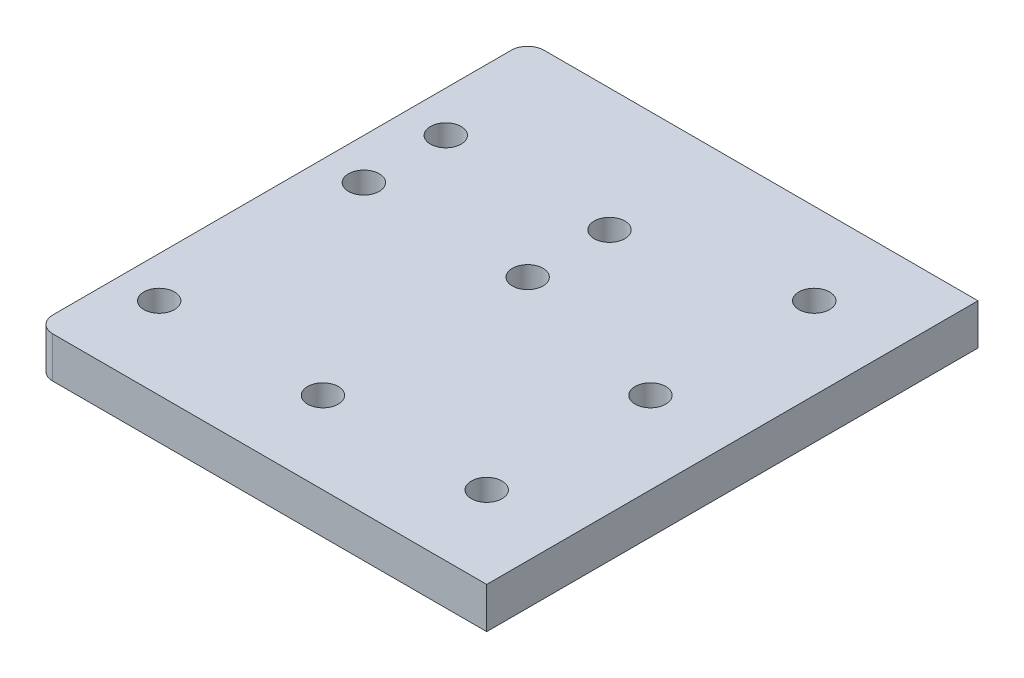
ISO-10303-21;
HEADER;
FILE_DESCRIPTION(('STEP AP214'),'2;1');
FILE_NAME('part.step','',(''),(''),'','','');
FILE_SCHEMA(('AUTOMOTIVE_DESIGN { 1 0 10303 214 1 1 1 1 }'));
ENDSEC;
DATA;
#1=APPLICATION_CONTEXT('core data for automotive mechanical design processes');
#2=APPLICATION_PROTOCOL_DEFINITION('international standard','automotive_design',2000,#1);
#3=PRODUCT_CONTEXT('',#1,'mechanical');
#4=PRODUCT('Part','Part','',(#3));
#5=PRODUCT_RELATED_PRODUCT_CATEGORY('part','',(#4));
#6=PRODUCT_DEFINITION_FORMATION('','',#4);
#7=PRODUCT_DEFINITION_CONTEXT('part definition',#1,'design');
#8=PRODUCT_DEFINITION('design','',#6,#7);
#9=PRODUCT_DEFINITION_SHAPE('','',#8);
#10=(LENGTH_UNIT() NAMED_UNIT(*) SI_UNIT(.MILLI.,.METRE.));
#11=(NAMED_UNIT(*) PLANE_ANGLE_UNIT() SI_UNIT($,.RADIAN.));
#12=(NAMED_UNIT(*) SI_UNIT($,.STERADIAN.) SOLID_ANGLE_UNIT());
#13=UNCERTAINTY_MEASURE_WITH_UNIT(LENGTH_MEASURE(1.E-05),#10,'distance_accuracy_value','');
#14=(GEOMETRIC_REPRESENTATION_CONTEXT(3) GLOBAL_UNCERTAINTY_ASSIGNED_CONTEXT((#13)) GLOBAL_UNIT_ASSIGNED_CONTEXT((#10,
#11,#12)) REPRESENTATION_CONTEXT('',''));
#15=CARTESIAN_POINT('',(0.,0.,0.));
#16=DIRECTION('',(0.,0.,1.));
#17=DIRECTION('',(1.,0.,0.));
#18=AXIS2_PLACEMENT_3D('',#15,#16,#17);
#19=CARTESIAN_POINT('',(0.,6.35,0.));
#20=DIRECTION('',(0.,1.,0.));
#21=DIRECTION('',(0.,0.,1.));
#22=AXIS2_PLACEMENT_3D('',#19,#20,#21);
#23=PLANE('',#22);
#24=CARTESIAN_POINT('',(-3.175,6.35,-19.05));
#25=DIRECTION('',(0.,1.,0.));
#26=DIRECTION('',(0.,0.,1.));
#27=AXIS2_PLACEMENT_3D('',#24,#25,#26);
#28=CIRCLE('',#27,2.38125);
#29=CARTESIAN_POINT('',(-3.175,6.35,-16.66875));
#30=VERTEX_POINT('',#29);
#31=EDGE_CURVE('E351',#30,#30,#28,.T.);
#32=ORIENTED_EDGE('',*,*,#31,.F.);
#33=EDGE_LOOP('',(#32));
#34=FACE_BOUND('',#33,.T.);
#35=CARTESIAN_POINT('',(-28.575,6.35,-6.34999999999997));
#36=DIRECTION('',(0.,1.,0.));
#37=DIRECTION('',(0.,0.,1.));
#38=AXIS2_PLACEMENT_3D('',#35,#36,#37);
#39=CIRCLE('',#38,2.38125);
#40=CARTESIAN_POINT('',(-28.575,6.35,-3.96874999999997));
#41=VERTEX_POINT('',#40);
#42=EDGE_CURVE('E363',#41,#41,#39,.T.);
#43=ORIENTED_EDGE('',*,*,#42,.F.);
#44=EDGE_LOOP('',(#43));
#45=FACE_BOUND('',#44,.T.);
#46=CARTESIAN_POINT('',(-28.575,6.35,25.4));
#47=DIRECTION('',(0.,1.,0.));
#48=DIRECTION('',(0.,0.,1.));
#49=AXIS2_PLACEMENT_3D('',#46,#47,#48);
#50=CIRCLE('',#49,2.38125);
#51=CARTESIAN_POINT('',(-28.575,6.35,27.78125));
#52=VERTEX_POINT('',#51);
#53=EDGE_CURVE('E375',#52,#52,#50,.T.);
#54=ORIENTED_EDGE('',*,*,#53,.F.);
#55=EDGE_LOOP('',(#54));
#56=FACE_BOUND('',#55,.T.);
#57=CARTESIAN_POINT('',(22.225,6.35,25.4));
#58=DIRECTION('',(0.,1.,0.));
#59=DIRECTION('',(0.,0.,1.));
#60=AXIS2_PLACEMENT_3D('',#57,#58,#59);
#61=CIRCLE('',#60,2.38125);
#62=CARTESIAN_POINT('',(22.225,6.35,27.78125));
#63=VERTEX_POINT('',#62);
#64=EDGE_CURVE('E387',#63,#63,#61,.T.);
#65=ORIENTED_EDGE('',*,*,#64,.F.);
#66=EDGE_LOOP('',(#65));
#67=FACE_BOUND('',#66,.T.);
#68=DIRECTION('',(-1.,0.,0.));
#69=VECTOR('',#68,1.);
#70=CARTESIAN_POINT('',(-34.925,6.35,-38.1));
#71=LINE('',#70,#69);
#72=CARTESIAN_POINT('',(34.925,6.35,-38.1));
#73=VERTEX_POINT('',#72);
#74=CARTESIAN_POINT('',(-32.385,6.35,-38.1));
#75=VERTEX_POINT('',#74);
#76=EDGE_CURVE('E89',#73,#75,#71,.T.);
#77=ORIENTED_EDGE('',*,*,#76,.T.);
#78=CARTESIAN_POINT('',(-32.385,6.35,-35.56));
#79=DIRECTION('',(0.,1.,0.));
#80=DIRECTION('',(0.,0.,1.));
#81=AXIS2_PLACEMENT_3D('',#78,#79,#80);
#82=CIRCLE('',#81,2.54);
#83=CARTESIAN_POINT('',(-34.925,6.35,-35.56));
#84=VERTEX_POINT('',#83);
#85=EDGE_CURVE('E44',#75,#84,#82,.T.);
#86=ORIENTED_EDGE('',*,*,#85,.T.);
#87=DIRECTION('',(0.,0.,1.));
#88=VECTOR('',#87,1.);
#89=CARTESIAN_POINT('',(-34.925,6.35,-38.1));
#90=LINE('',#89,#88);
#91=CARTESIAN_POINT('',(-34.925,6.35,35.56));
#92=VERTEX_POINT('',#91);
#93=EDGE_CURVE('E96',#84,#92,#90,.T.);
#94=ORIENTED_EDGE('',*,*,#93,.T.);
#95=CARTESIAN_POINT('',(-32.385,6.35,35.56));
#96=DIRECTION('',(0.,1.,0.));
#97=DIRECTION('',(0.,0.,1.));
#98=AXIS2_PLACEMENT_3D('',#95,#96,#97);
#99=CIRCLE('',#98,2.54);
#100=CARTESIAN_POINT('',(-32.385,6.35,38.1));
#101=VERTEX_POINT('',#100);
#102=EDGE_CURVE('E51',#92,#101,#99,.T.);
#103=ORIENTED_EDGE('',*,*,#102,.T.);
#104=DIRECTION('',(1.,0.,0.));
#105=VECTOR('',#104,1.);
#106=CARTESIAN_POINT('',(-34.925,6.35,38.1));
#107=LINE('',#106,#105);
#108=CARTESIAN_POINT('',(34.925,6.35,38.1));
#109=VERTEX_POINT('',#108);
#110=EDGE_CURVE('E101',#101,#109,#107,.T.);
#111=ORIENTED_EDGE('',*,*,#110,.T.);
#112=DIRECTION('',(0.,0.,-1.));
#113=VECTOR('',#112,1.);
#114=CARTESIAN_POINT('',(34.925,6.35,-38.1));
#115=LINE('',#114,#113);
#116=EDGE_CURVE('E97',#109,#73,#115,.T.);
#117=ORIENTED_EDGE('',*,*,#116,.T.);
#118=EDGE_LOOP('',(#77,#86,#94,#103,#111,#117));
#119=FACE_BOUND('',#118,.T.);
#120=CARTESIAN_POINT('',(22.225,6.35,0.));
#121=DIRECTION('',(0.,1.,0.));
#122=DIRECTION('',(0.,0.,1.));
#123=AXIS2_PLACEMENT_3D('',#120,#121,#122);
#124=CIRCLE('',#123,2.38125);
#125=CARTESIAN_POINT('',(22.225,6.35,2.38125000000002));
#126=VERTEX_POINT('',#125);
#127=EDGE_CURVE('E142',#126,#126,#124,.T.);
#128=ORIENTED_EDGE('',*,*,#127,.F.);
#129=EDGE_LOOP('',(#128));
#130=FACE_BOUND('',#129,.T.);
#131=CARTESIAN_POINT('',(22.225,6.35,-25.4));
#132=DIRECTION('',(0.,1.,0.));
#133=DIRECTION('',(0.,0.,1.));
#134=AXIS2_PLACEMENT_3D('',#131,#132,#133);
#135=CIRCLE('',#134,2.38125);
#136=CARTESIAN_POINT('',(22.225,6.35,-23.01875));
#137=VERTEX_POINT('',#136);
#138=EDGE_CURVE('E381',#137,#137,#135,.T.);
#139=ORIENTED_EDGE('',*,*,#138,.F.);
#140=EDGE_LOOP('',(#139));
#141=FACE_BOUND('',#140,.T.);
#142=CARTESIAN_POINT('',(-28.575,6.35,-19.05));
#143=DIRECTION('',(0.,1.,0.));
#144=DIRECTION('',(0.,0.,1.));
#145=AXIS2_PLACEMENT_3D('',#142,#143,#144);
#146=CIRCLE('',#145,2.38125);
#147=CARTESIAN_POINT('',(-28.575,6.35,-16.66875));
#148=VERTEX_POINT('',#147);
#149=EDGE_CURVE('E369',#148,#148,#146,.T.);
#150=ORIENTED_EDGE('',*,*,#149,.F.);
#151=EDGE_LOOP('',(#150));
#152=FACE_BOUND('',#151,.T.);
#153=CARTESIAN_POINT('',(-3.175,6.35,25.4));
#154=DIRECTION('',(0.,1.,0.));
#155=DIRECTION('',(0.,0.,1.));
#156=AXIS2_PLACEMENT_3D('',#153,#154,#155);
#157=CIRCLE('',#156,2.38125);
#158=CARTESIAN_POINT('',(-3.175,6.35,27.78125));
#159=VERTEX_POINT('',#158);
#160=EDGE_CURVE('E357',#159,#159,#157,.T.);
#161=ORIENTED_EDGE('',*,*,#160,.F.);
#162=EDGE_LOOP('',(#161));
#163=FACE_BOUND('',#162,.T.);
#164=CARTESIAN_POINT('',(-3.175,6.35,-6.34999999999997));
#165=DIRECTION('',(0.,1.,0.));
#166=DIRECTION('',(0.,0.,1.));
#167=AXIS2_PLACEMENT_3D('',#164,#165,#166);
#168=CIRCLE('',#167,2.38125);
#169=CARTESIAN_POINT('',(-3.175,6.35,-3.96874999999997));
#170=VERTEX_POINT('',#169);
#171=EDGE_CURVE('E342',#170,#170,#168,.T.);
#172=ORIENTED_EDGE('',*,*,#171,.F.);
#173=EDGE_LOOP('',(#172));
#174=FACE_BOUND('',#173,.T.);
#175=ADVANCED_FACE('F36',(#34,#45,#56,#67,#119,#130,#141,#152,#163,#174),#23,.T.);
#176=CARTESIAN_POINT('',(0.,0.,0.));
#177=DIRECTION('',(0.,1.,0.));
#178=DIRECTION('',(0.,0.,1.));
#179=AXIS2_PLACEMENT_3D('',#176,#177,#178);
#180=PLANE('',#179);
#181=DIRECTION('',(0.,0.,1.));
#182=VECTOR('',#181,1.);
#183=CARTESIAN_POINT('',(-34.925,0.,-38.1));
#184=LINE('',#183,#182);
#185=CARTESIAN_POINT('',(-34.925,0.,-35.56));
#186=VERTEX_POINT('',#185);
#187=CARTESIAN_POINT('',(-34.925,0.,35.56));
#188=VERTEX_POINT('',#187);
#189=EDGE_CURVE('E139',#186,#188,#184,.T.);
#190=ORIENTED_EDGE('',*,*,#189,.F.);
#191=CARTESIAN_POINT('',(-32.385,0.,-35.56));
#192=DIRECTION('',(0.,1.,0.));
#193=DIRECTION('',(0.,0.,1.));
#194=AXIS2_PLACEMENT_3D('',#191,#192,#193);
#195=CIRCLE('',#194,2.54);
#196=CARTESIAN_POINT('',(-32.385,0.,-38.1));
#197=VERTEX_POINT('',#196);
#198=EDGE_CURVE('E122',#186,#197,#195,.F.);
#199=ORIENTED_EDGE('',*,*,#198,.T.);
#200=DIRECTION('',(-1.,0.,0.));
#201=VECTOR('',#200,1.);
#202=CARTESIAN_POINT('',(-34.925,0.,-38.1));
#203=LINE('',#202,#201);
#204=CARTESIAN_POINT('',(34.925,0.,-38.1));
#205=VERTEX_POINT('',#204);
#206=EDGE_CURVE('E138',#205,#197,#203,.T.);
#207=ORIENTED_EDGE('',*,*,#206,.F.);
#208=DIRECTION('',(0.,0.,-1.));
#209=VECTOR('',#208,1.);
#210=CARTESIAN_POINT('',(34.925,0.,-38.1));
#211=LINE('',#210,#209);
#212=CARTESIAN_POINT('',(34.925,0.,38.1));
#213=VERTEX_POINT('',#212);
#214=EDGE_CURVE('E109',#213,#205,#211,.T.);
#215=ORIENTED_EDGE('',*,*,#214,.F.);
#216=DIRECTION('',(1.,0.,0.));
#217=VECTOR('',#216,1.);
#218=CARTESIAN_POINT('',(-34.925,0.,38.1));
#219=LINE('',#218,#217);
#220=CARTESIAN_POINT('',(-32.385,0.,38.1));
#221=VERTEX_POINT('',#220);
#222=EDGE_CURVE('E105',#221,#213,#219,.T.);
#223=ORIENTED_EDGE('',*,*,#222,.F.);
#224=CARTESIAN_POINT('',(-32.385,0.,35.56));
#225=DIRECTION('',(0.,1.,0.));
#226=DIRECTION('',(0.,0.,1.));
#227=AXIS2_PLACEMENT_3D('',#224,#225,#226);
#228=CIRCLE('',#227,2.54);
#229=EDGE_CURVE('E120',#221,#188,#228,.F.);
#230=ORIENTED_EDGE('',*,*,#229,.T.);
#231=EDGE_LOOP('',(#190,#199,#207,#215,#223,#230));
#232=FACE_BOUND('',#231,.T.);
#233=CARTESIAN_POINT('',(22.225,0.,0.));
#234=DIRECTION('',(0.,1.,0.));
#235=DIRECTION('',(0.,0.,1.));
#236=AXIS2_PLACEMENT_3D('',#233,#234,#235);
#237=CIRCLE('',#236,2.38125);
#238=CARTESIAN_POINT('',(22.225,0.,2.38125000000002));
#239=VERTEX_POINT('',#238);
#240=EDGE_CURVE('E390',#239,#239,#237,.T.);
#241=ORIENTED_EDGE('',*,*,#240,.T.);
#242=EDGE_LOOP('',(#241));
#243=FACE_BOUND('',#242,.T.);
#244=CARTESIAN_POINT('',(22.225,0.,25.4));
#245=DIRECTION('',(0.,1.,0.));
#246=DIRECTION('',(0.,0.,1.));
#247=AXIS2_PLACEMENT_3D('',#244,#245,#246);
#248=CIRCLE('',#247,2.38125);
#249=CARTESIAN_POINT('',(22.225,0.,27.78125));
#250=VERTEX_POINT('',#249);
#251=EDGE_CURVE('E384',#250,#250,#248,.T.);
#252=ORIENTED_EDGE('',*,*,#251,.T.);
#253=EDGE_LOOP('',(#252));
#254=FACE_BOUND('',#253,.T.);
#255=CARTESIAN_POINT('',(22.225,0.,-25.4));
#256=DIRECTION('',(0.,1.,0.));
#257=DIRECTION('',(0.,0.,1.));
#258=AXIS2_PLACEMENT_3D('',#255,#256,#257);
#259=CIRCLE('',#258,2.38125);
#260=CARTESIAN_POINT('',(22.225,0.,-23.01875));
#261=VERTEX_POINT('',#260);
#262=EDGE_CURVE('E378',#261,#261,#259,.T.);
#263=ORIENTED_EDGE('',*,*,#262,.T.);
#264=EDGE_LOOP('',(#263));
#265=FACE_BOUND('',#264,.T.);
#266=CARTESIAN_POINT('',(-28.575,0.,25.4));
#267=DIRECTION('',(0.,1.,0.));
#268=DIRECTION('',(0.,0.,1.));
#269=AXIS2_PLACEMENT_3D('',#266,#267,#268);
#270=CIRCLE('',#269,2.38125);
#271=CARTESIAN_POINT('',(-28.575,0.,27.78125));
#272=VERTEX_POINT('',#271);
#273=EDGE_CURVE('E372',#272,#272,#270,.T.);
#274=ORIENTED_EDGE('',*,*,#273,.T.);
#275=EDGE_LOOP('',(#274));
#276=FACE_BOUND('',#275,.T.);
#277=CARTESIAN_POINT('',(-28.575,0.,-19.05));
#278=DIRECTION('',(0.,1.,0.));
#279=DIRECTION('',(0.,0.,1.));
#280=AXIS2_PLACEMENT_3D('',#277,#278,#279);
#281=CIRCLE('',#280,2.38125);
#282=CARTESIAN_POINT('',(-28.575,0.,-16.66875));
#283=VERTEX_POINT('',#282);
#284=EDGE_CURVE('E366',#283,#283,#281,.T.);
#285=ORIENTED_EDGE('',*,*,#284,.T.);
#286=EDGE_LOOP('',(#285));
#287=FACE_BOUND('',#286,.T.);
#288=CARTESIAN_POINT('',(-28.575,0.,-6.34999999999997));
#289=DIRECTION('',(0.,1.,0.));
#290=DIRECTION('',(0.,0.,1.));
#291=AXIS2_PLACEMENT_3D('',#288,#289,#290);
#292=CIRCLE('',#291,2.38125);
#293=CARTESIAN_POINT('',(-28.575,0.,-3.96874999999997));
#294=VERTEX_POINT('',#293);
#295=EDGE_CURVE('E360',#294,#294,#292,.T.);
#296=ORIENTED_EDGE('',*,*,#295,.T.);
#297=EDGE_LOOP('',(#296));
#298=FACE_BOUND('',#297,.T.);
#299=CARTESIAN_POINT('',(-3.175,0.,25.4));
#300=DIRECTION('',(0.,1.,0.));
#301=DIRECTION('',(0.,0.,1.));
#302=AXIS2_PLACEMENT_3D('',#299,#300,#301);
#303=CIRCLE('',#302,2.38125);
#304=CARTESIAN_POINT('',(-3.175,0.,27.78125));
#305=VERTEX_POINT('',#304);
#306=EDGE_CURVE('E354',#305,#305,#303,.T.);
#307=ORIENTED_EDGE('',*,*,#306,.T.);
#308=EDGE_LOOP('',(#307));
#309=FACE_BOUND('',#308,.T.);
#310=CARTESIAN_POINT('',(-3.175,0.,-19.05));
#311=DIRECTION('',(0.,1.,0.));
#312=DIRECTION('',(0.,0.,1.));
#313=AXIS2_PLACEMENT_3D('',#310,#311,#312);
#314=CIRCLE('',#313,2.38125);
#315=CARTESIAN_POINT('',(-3.175,0.,-16.66875));
#316=VERTEX_POINT('',#315);
#317=EDGE_CURVE('E348',#316,#316,#314,.T.);
#318=ORIENTED_EDGE('',*,*,#317,.T.);
#319=EDGE_LOOP('',(#318));
#320=FACE_BOUND('',#319,.T.);
#321=CARTESIAN_POINT('',(-3.175,0.,-6.34999999999997));
#322=DIRECTION('',(0.,1.,0.));
#323=DIRECTION('',(0.,0.,1.));
#324=AXIS2_PLACEMENT_3D('',#321,#322,#323);
#325=CIRCLE('',#324,2.38125);
#326=CARTESIAN_POINT('',(-3.175,0.,-3.96874999999997));
#327=VERTEX_POINT('',#326);
#328=EDGE_CURVE('E345',#327,#327,#325,.T.);
#329=ORIENTED_EDGE('',*,*,#328,.T.);
#330=EDGE_LOOP('',(#329));
#331=FACE_BOUND('',#330,.T.);
#332=ADVANCED_FACE('F136',(#232,#243,#254,#265,#276,#287,#298,#309,#320,#331),#180,.F.);
#333=CARTESIAN_POINT('',(34.925,6.35,-38.1));
#334=DIRECTION('',(-1.,0.,0.));
#335=DIRECTION('',(0.,0.,1.));
#336=AXIS2_PLACEMENT_3D('',#333,#334,#335);
#337=PLANE('',#336);
#338=ORIENTED_EDGE('',*,*,#214,.T.);
#339=DIRECTION('',(0.,-1.,0.));
#340=VECTOR('',#339,1.);
#341=CARTESIAN_POINT('',(34.925,6.35,-38.1));
#342=LINE('',#341,#340);
#343=EDGE_CURVE('E93',#73,#205,#342,.T.);
#344=ORIENTED_EDGE('',*,*,#343,.F.);
#345=ORIENTED_EDGE('',*,*,#116,.F.);
#346=DIRECTION('',(0.,-1.,0.));
#347=VECTOR('',#346,1.);
#348=CARTESIAN_POINT('',(34.925,6.35,38.1));
#349=LINE('',#348,#347);
#350=EDGE_CURVE('E111',#109,#213,#349,.T.);
#351=ORIENTED_EDGE('',*,*,#350,.T.);
#352=EDGE_LOOP('',(#338,#344,#345,#351));
#353=FACE_BOUND('',#352,.T.);
#354=ADVANCED_FACE('F107',(#353),#337,.F.);
#355=CARTESIAN_POINT('',(-34.925,6.35,-38.1));
#356=DIRECTION('',(0.,0.,1.));
#357=DIRECTION('',(1.,0.,0.));
#358=AXIS2_PLACEMENT_3D('',#355,#356,#357);
#359=PLANE('',#358);
#360=ORIENTED_EDGE('',*,*,#206,.T.);
#361=DIRECTION('',(0.,-1.,0.));
#362=VECTOR('',#361,1.);
#363=CARTESIAN_POINT('',(-32.385,6.35,-38.1));
#364=LINE('',#363,#362);
#365=EDGE_CURVE('E59',#197,#75,#364,.F.);
#366=ORIENTED_EDGE('',*,*,#365,.T.);
#367=ORIENTED_EDGE('',*,*,#76,.F.);
#368=ORIENTED_EDGE('',*,*,#343,.T.);
#369=EDGE_LOOP('',(#360,#366,#367,#368));
#370=FACE_BOUND('',#369,.T.);
#371=ADVANCED_FACE('F91',(#370),#359,.F.);
#372=CARTESIAN_POINT('',(-34.925,6.35,-38.1));
#373=DIRECTION('',(1.,0.,0.));
#374=DIRECTION('',(0.,0.,-1.));
#375=AXIS2_PLACEMENT_3D('',#372,#373,#374);
#376=PLANE('',#375);
#377=ORIENTED_EDGE('',*,*,#93,.F.);
#378=DIRECTION('',(0.,-1.,0.));
#379=VECTOR('',#378,1.);
#380=CARTESIAN_POINT('',(-34.925,6.35,-35.56));
#381=LINE('',#380,#379);
#382=EDGE_CURVE('E113',#84,#186,#381,.T.);
#383=ORIENTED_EDGE('',*,*,#382,.T.);
#384=ORIENTED_EDGE('',*,*,#189,.T.);
#385=DIRECTION('',(0.,-1.,0.));
#386=VECTOR('',#385,1.);
#387=CARTESIAN_POINT('',(-34.925,6.35,35.56));
#388=LINE('',#387,#386);
#389=EDGE_CURVE('E110',#188,#92,#388,.F.);
#390=ORIENTED_EDGE('',*,*,#389,.T.);
#391=EDGE_LOOP('',(#377,#383,#384,#390));
#392=FACE_BOUND('',#391,.T.);
#393=ADVANCED_FACE('F129',(#392),#376,.F.);
#394=CARTESIAN_POINT('',(-34.925,6.35,38.1));
#395=DIRECTION('',(0.,0.,-1.));
#396=DIRECTION('',(-1.,0.,0.));
#397=AXIS2_PLACEMENT_3D('',#394,#395,#396);
#398=PLANE('',#397);
#399=ORIENTED_EDGE('',*,*,#110,.F.);
#400=DIRECTION('',(0.,-1.,0.));
#401=VECTOR('',#400,1.);
#402=CARTESIAN_POINT('',(-32.385,6.35,38.1));
#403=LINE('',#402,#401);
#404=EDGE_CURVE('E11',#101,#221,#403,.T.);
#405=ORIENTED_EDGE('',*,*,#404,.T.);
#406=ORIENTED_EDGE('',*,*,#222,.T.);
#407=ORIENTED_EDGE('',*,*,#350,.F.);
#408=EDGE_LOOP('',(#399,#405,#406,#407));
#409=FACE_BOUND('',#408,.T.);
#410=ADVANCED_FACE('F147',(#409),#398,.F.);
#411=CARTESIAN_POINT('',(22.225,6.35,0.));
#412=DIRECTION('',(0.,-1.,0.));
#413=DIRECTION('',(0.,0.,-1.));
#414=AXIS2_PLACEMENT_3D('',#411,#412,#413);
#415=CYLINDRICAL_SURFACE('',#414,2.38125);
#416=ORIENTED_EDGE('',*,*,#127,.T.);
#417=EDGE_LOOP('',(#416));
#418=FACE_BOUND('',#417,.T.);
#419=ORIENTED_EDGE('',*,*,#240,.F.);
#420=EDGE_LOOP('',(#419));
#421=FACE_BOUND('',#420,.T.);
#422=ADVANCED_FACE('F165',(#418,#421),#415,.F.);
#423=CARTESIAN_POINT('',(22.225,6.35,25.4));
#424=DIRECTION('',(0.,-1.,0.));
#425=DIRECTION('',(0.,0.,-1.));
#426=AXIS2_PLACEMENT_3D('',#423,#424,#425);
#427=CYLINDRICAL_SURFACE('',#426,2.38125);
#428=ORIENTED_EDGE('',*,*,#64,.T.);
#429=EDGE_LOOP('',(#428));
#430=FACE_BOUND('',#429,.T.);
#431=ORIENTED_EDGE('',*,*,#251,.F.);
#432=EDGE_LOOP('',(#431));
#433=FACE_BOUND('',#432,.T.);
#434=ADVANCED_FACE('F198',(#430,#433),#427,.F.);
#435=CARTESIAN_POINT('',(22.225,6.35,-25.4));
#436=DIRECTION('',(0.,-1.,0.));
#437=DIRECTION('',(0.,0.,-1.));
#438=AXIS2_PLACEMENT_3D('',#435,#436,#437);
#439=CYLINDRICAL_SURFACE('',#438,2.38125);
#440=ORIENTED_EDGE('',*,*,#138,.T.);
#441=EDGE_LOOP('',(#440));
#442=FACE_BOUND('',#441,.T.);
#443=ORIENTED_EDGE('',*,*,#262,.F.);
#444=EDGE_LOOP('',(#443));
#445=FACE_BOUND('',#444,.T.);
#446=ADVANCED_FACE('F205',(#442,#445),#439,.F.);
#447=CARTESIAN_POINT('',(-28.575,6.35,25.4));
#448=DIRECTION('',(0.,-1.,0.));
#449=DIRECTION('',(0.,0.,-1.));
#450=AXIS2_PLACEMENT_3D('',#447,#448,#449);
#451=CYLINDRICAL_SURFACE('',#450,2.38125);
#452=ORIENTED_EDGE('',*,*,#53,.T.);
#453=EDGE_LOOP('',(#452));
#454=FACE_BOUND('',#453,.T.);
#455=ORIENTED_EDGE('',*,*,#273,.F.);
#456=EDGE_LOOP('',(#455));
#457=FACE_BOUND('',#456,.T.);
#458=ADVANCED_FACE('F212',(#454,#457),#451,.F.);
#459=CARTESIAN_POINT('',(-28.575,6.35,-19.05));
#460=DIRECTION('',(0.,-1.,0.));
#461=DIRECTION('',(0.,0.,-1.));
#462=AXIS2_PLACEMENT_3D('',#459,#460,#461);
#463=CYLINDRICAL_SURFACE('',#462,2.38125);
#464=ORIENTED_EDGE('',*,*,#149,.T.);
#465=EDGE_LOOP('',(#464));
#466=FACE_BOUND('',#465,.T.);
#467=ORIENTED_EDGE('',*,*,#284,.F.);
#468=EDGE_LOOP('',(#467));
#469=FACE_BOUND('',#468,.T.);
#470=ADVANCED_FACE('F220',(#466,#469),#463,.F.);
#471=CARTESIAN_POINT('',(-28.575,6.35,-6.34999999999997));
#472=DIRECTION('',(0.,-1.,0.));
#473=DIRECTION('',(0.,0.,-1.));
#474=AXIS2_PLACEMENT_3D('',#471,#472,#473);
#475=CYLINDRICAL_SURFACE('',#474,2.38125);
#476=ORIENTED_EDGE('',*,*,#42,.T.);
#477=EDGE_LOOP('',(#476));
#478=FACE_BOUND('',#477,.T.);
#479=ORIENTED_EDGE('',*,*,#295,.F.);
#480=EDGE_LOOP('',(#479));
#481=FACE_BOUND('',#480,.T.);
#482=ADVANCED_FACE('F228',(#478,#481),#475,.F.);
#483=CARTESIAN_POINT('',(-3.175,6.35,25.4));
#484=DIRECTION('',(0.,-1.,0.));
#485=DIRECTION('',(0.,0.,-1.));
#486=AXIS2_PLACEMENT_3D('',#483,#484,#485);
#487=CYLINDRICAL_SURFACE('',#486,2.38125);
#488=ORIENTED_EDGE('',*,*,#160,.T.);
#489=EDGE_LOOP('',(#488));
#490=FACE_BOUND('',#489,.T.);
#491=ORIENTED_EDGE('',*,*,#306,.F.);
#492=EDGE_LOOP('',(#491));
#493=FACE_BOUND('',#492,.T.);
#494=ADVANCED_FACE('F236',(#490,#493),#487,.F.);
#495=CARTESIAN_POINT('',(-3.175,6.35,-19.05));
#496=DIRECTION('',(0.,-1.,0.));
#497=DIRECTION('',(0.,0.,-1.));
#498=AXIS2_PLACEMENT_3D('',#495,#496,#497);
#499=CYLINDRICAL_SURFACE('',#498,2.38125);
#500=ORIENTED_EDGE('',*,*,#31,.T.);
#501=EDGE_LOOP('',(#500));
#502=FACE_BOUND('',#501,.T.);
#503=ORIENTED_EDGE('',*,*,#317,.F.);
#504=EDGE_LOOP('',(#503));
#505=FACE_BOUND('',#504,.T.);
#506=ADVANCED_FACE('F244',(#502,#505),#499,.F.);
#507=CARTESIAN_POINT('',(-3.175,6.35,-6.34999999999997));
#508=DIRECTION('',(0.,-1.,0.));
#509=DIRECTION('',(0.,0.,-1.));
#510=AXIS2_PLACEMENT_3D('',#507,#508,#509);
#511=CYLINDRICAL_SURFACE('',#510,2.38125);
#512=ORIENTED_EDGE('',*,*,#171,.T.);
#513=EDGE_LOOP('',(#512));
#514=FACE_BOUND('',#513,.T.);
#515=ORIENTED_EDGE('',*,*,#328,.F.);
#516=EDGE_LOOP('',(#515));
#517=FACE_BOUND('',#516,.T.);
#518=ADVANCED_FACE('F154',(#514,#517),#511,.F.);
#519=CARTESIAN_POINT('',(-32.385,6.35,-35.56));
#520=DIRECTION('',(0.,-1.,0.));
#521=DIRECTION('',(0.,0.,-1.));
#522=AXIS2_PLACEMENT_3D('',#519,#520,#521);
#523=CYLINDRICAL_SURFACE('',#522,2.54);
#524=ORIENTED_EDGE('',*,*,#85,.F.);
#525=ORIENTED_EDGE('',*,*,#365,.F.);
#526=ORIENTED_EDGE('',*,*,#198,.F.);
#527=ORIENTED_EDGE('',*,*,#382,.F.);
#528=EDGE_LOOP('',(#524,#525,#526,#527));
#529=FACE_BOUND('',#528,.T.);
#530=ADVANCED_FACE('F134',(#529),#523,.T.);
#531=CARTESIAN_POINT('',(-32.385,6.35,35.56));
#532=DIRECTION('',(0.,-1.,0.));
#533=DIRECTION('',(0.,0.,-1.));
#534=AXIS2_PLACEMENT_3D('',#531,#532,#533);
#535=CYLINDRICAL_SURFACE('',#534,2.54);
#536=ORIENTED_EDGE('',*,*,#102,.F.);
#537=ORIENTED_EDGE('',*,*,#389,.F.);
#538=ORIENTED_EDGE('',*,*,#229,.F.);
#539=ORIENTED_EDGE('',*,*,#404,.F.);
#540=EDGE_LOOP('',(#536,#537,#538,#539));
#541=FACE_BOUND('',#540,.T.);
#542=ADVANCED_FACE('F38',(#541),#535,.T.);
#543=CLOSED_SHELL('',(#175,#332,#354,#371,#393,#410,#422,#434,#446,#458,#470,#482,#494,#506,
#518,#530,#542));
#544=MANIFOLD_SOLID_BREP('B2',#543);
#545=ADVANCED_BREP_SHAPE_REPRESENTATION('',(#18,#544),#14);
#546=SHAPE_DEFINITION_REPRESENTATION(#9,#545);
ENDSEC;
END-ISO-10303-21;
